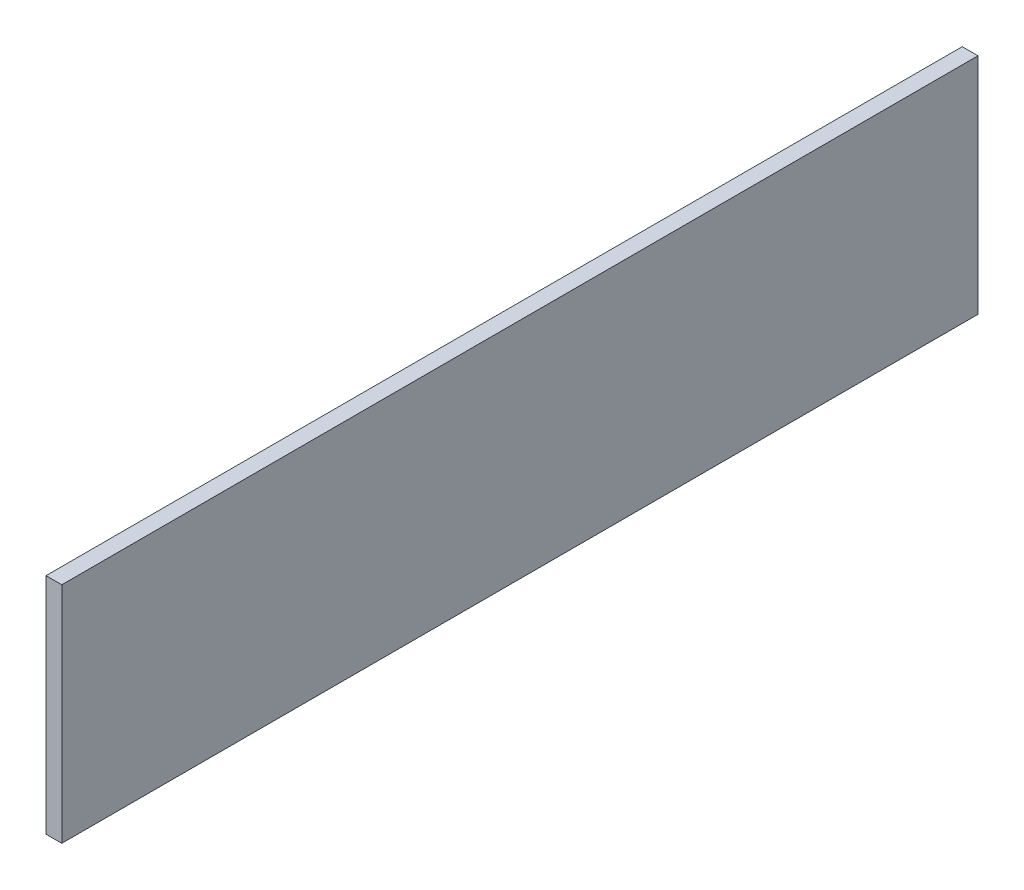
ISO-10303-21;
HEADER;
FILE_DESCRIPTION(('STEP AP214'),'2;1');
FILE_NAME('part.step','',(''),(''),'','','');
FILE_SCHEMA(('AUTOMOTIVE_DESIGN { 1 0 10303 214 1 1 1 1 }'));
ENDSEC;
DATA;
#1=APPLICATION_CONTEXT('core data for automotive mechanical design processes');
#2=APPLICATION_PROTOCOL_DEFINITION('international standard','automotive_design',2000,#1);
#3=PRODUCT_CONTEXT('',#1,'mechanical');
#4=PRODUCT('Part','Part','',(#3));
#5=PRODUCT_RELATED_PRODUCT_CATEGORY('part','',(#4));
#6=PRODUCT_DEFINITION_FORMATION('','',#4);
#7=PRODUCT_DEFINITION_CONTEXT('part definition',#1,'design');
#8=PRODUCT_DEFINITION('design','',#6,#7);
#9=PRODUCT_DEFINITION_SHAPE('','',#8);
#10=(LENGTH_UNIT() NAMED_UNIT(*) SI_UNIT(.MILLI.,.METRE.));
#11=(NAMED_UNIT(*) PLANE_ANGLE_UNIT() SI_UNIT($,.RADIAN.));
#12=(NAMED_UNIT(*) SI_UNIT($,.STERADIAN.) SOLID_ANGLE_UNIT());
#13=UNCERTAINTY_MEASURE_WITH_UNIT(LENGTH_MEASURE(1.E-05),#10,'distance_accuracy_value','');
#14=(GEOMETRIC_REPRESENTATION_CONTEXT(3) GLOBAL_UNCERTAINTY_ASSIGNED_CONTEXT((#13)) GLOBAL_UNIT_ASSIGNED_CONTEXT((#10,
#11,#12)) REPRESENTATION_CONTEXT('',''));
#15=CARTESIAN_POINT('',(0.,0.,0.));
#16=DIRECTION('',(0.,0.,1.));
#17=DIRECTION('',(1.,0.,0.));
#18=AXIS2_PLACEMENT_3D('',#15,#16,#17);
#19=CARTESIAN_POINT('',(5.,-26.218954248366,42.2287581699346));
#20=DIRECTION('',(0.,0.,-1.));
#21=DIRECTION('',(-1.,0.,0.));
#22=AXIS2_PLACEMENT_3D('',#19,#20,#21);
#23=PLANE('',#22);
#24=DIRECTION('',(0.,-1.,0.));
#25=VECTOR('',#24,1.);
#26=CARTESIAN_POINT('',(0.,-26.218954248366,42.2287581699346));
#27=LINE('',#26,#25);
#28=CARTESIAN_POINT('',(0.,44.781045751634,42.2287581699346));
#29=VERTEX_POINT('',#28);
#30=CARTESIAN_POINT('',(0.,-26.218954248366,42.2287581699346));
#31=VERTEX_POINT('',#30);
#32=EDGE_CURVE('E95',#29,#31,#27,.T.);
#33=ORIENTED_EDGE('',*,*,#32,.T.);
#34=DIRECTION('',(-1.,0.,0.));
#35=VECTOR('',#34,1.);
#36=CARTESIAN_POINT('',(5.,-26.218954248366,42.2287581699346));
#37=LINE('',#36,#35);
#38=CARTESIAN_POINT('',(5.,-26.218954248366,42.2287581699346));
#39=VERTEX_POINT('',#38);
#40=EDGE_CURVE('E11',#39,#31,#37,.T.);
#41=ORIENTED_EDGE('',*,*,#40,.F.);
#42=DIRECTION('',(0.,-1.,0.));
#43=VECTOR('',#42,1.);
#44=CARTESIAN_POINT('',(5.,-26.218954248366,42.2287581699346));
#45=LINE('',#44,#43);
#46=CARTESIAN_POINT('',(5.,44.781045751634,42.2287581699346));
#47=VERTEX_POINT('',#46);
#48=EDGE_CURVE('E83',#47,#39,#45,.T.);
#49=ORIENTED_EDGE('',*,*,#48,.F.);
#50=DIRECTION('',(-1.,0.,0.));
#51=VECTOR('',#50,1.);
#52=CARTESIAN_POINT('',(5.,44.781045751634,42.2287581699346));
#53=LINE('',#52,#51);
#54=EDGE_CURVE('E91',#47,#29,#53,.T.);
#55=ORIENTED_EDGE('',*,*,#54,.T.);
#56=EDGE_LOOP('',(#33,#41,#49,#55));
#57=FACE_BOUND('',#56,.T.);
#58=ADVANCED_FACE('F32',(#57),#23,.F.);
#59=CARTESIAN_POINT('',(5.,-26.218954248366,42.2287581699346));
#60=DIRECTION('',(0.,1.,0.));
#61=DIRECTION('',(0.,0.,1.));
#62=AXIS2_PLACEMENT_3D('',#59,#60,#61);
#63=PLANE('',#62);
#64=DIRECTION('',(0.,0.,-1.));
#65=VECTOR('',#64,1.);
#66=CARTESIAN_POINT('',(0.,-26.218954248366,42.2287581699346));
#67=LINE('',#66,#65);
#68=CARTESIAN_POINT('',(0.,-26.218954248366,-248.271241830065));
#69=VERTEX_POINT('',#68);
#70=EDGE_CURVE('E87',#31,#69,#67,.T.);
#71=ORIENTED_EDGE('',*,*,#70,.T.);
#72=DIRECTION('',(-1.,0.,0.));
#73=VECTOR('',#72,1.);
#74=CARTESIAN_POINT('',(5.,-26.218954248366,-248.271241830065));
#75=LINE('',#74,#73);
#76=CARTESIAN_POINT('',(5.,-26.218954248366,-248.271241830065));
#77=VERTEX_POINT('',#76);
#78=EDGE_CURVE('E40',#77,#69,#75,.T.);
#79=ORIENTED_EDGE('',*,*,#78,.F.);
#80=DIRECTION('',(0.,0.,-1.));
#81=VECTOR('',#80,1.);
#82=CARTESIAN_POINT('',(5.,-26.218954248366,42.2287581699346));
#83=LINE('',#82,#81);
#84=EDGE_CURVE('E78',#39,#77,#83,.T.);
#85=ORIENTED_EDGE('',*,*,#84,.F.);
#86=ORIENTED_EDGE('',*,*,#40,.T.);
#87=EDGE_LOOP('',(#71,#79,#85,#86));
#88=FACE_BOUND('',#87,.T.);
#89=ADVANCED_FACE('F86',(#88),#63,.F.);
#90=CARTESIAN_POINT('',(5.,-26.218954248366,-248.271241830065));
#91=DIRECTION('',(0.,0.,1.));
#92=DIRECTION('',(1.,0.,0.));
#93=AXIS2_PLACEMENT_3D('',#90,#91,#92);
#94=PLANE('',#93);
#95=DIRECTION('',(0.,1.,0.));
#96=VECTOR('',#95,1.);
#97=CARTESIAN_POINT('',(0.,-26.218954248366,-248.271241830065));
#98=LINE('',#97,#96);
#99=CARTESIAN_POINT('',(0.,44.781045751634,-248.271241830065));
#100=VERTEX_POINT('',#99);
#101=EDGE_CURVE('E65',#69,#100,#98,.T.);
#102=ORIENTED_EDGE('',*,*,#101,.T.);
#103=DIRECTION('',(-1.,0.,0.));
#104=VECTOR('',#103,1.);
#105=CARTESIAN_POINT('',(5.,44.781045751634,-248.271241830065));
#106=LINE('',#105,#104);
#107=CARTESIAN_POINT('',(5.,44.781045751634,-248.271241830065));
#108=VERTEX_POINT('',#107);
#109=EDGE_CURVE('E88',#108,#100,#106,.T.);
#110=ORIENTED_EDGE('',*,*,#109,.F.);
#111=DIRECTION('',(0.,1.,0.));
#112=VECTOR('',#111,1.);
#113=CARTESIAN_POINT('',(5.,-26.218954248366,-248.271241830065));
#114=LINE('',#113,#112);
#115=EDGE_CURVE('E81',#77,#108,#114,.T.);
#116=ORIENTED_EDGE('',*,*,#115,.F.);
#117=ORIENTED_EDGE('',*,*,#78,.T.);
#118=EDGE_LOOP('',(#102,#110,#116,#117));
#119=FACE_BOUND('',#118,.T.);
#120=ADVANCED_FACE('F89',(#119),#94,.F.);
#121=CARTESIAN_POINT('',(5.,44.781045751634,42.2287581699346));
#122=DIRECTION('',(0.,-1.,0.));
#123=DIRECTION('',(0.,0.,-1.));
#124=AXIS2_PLACEMENT_3D('',#121,#122,#123);
#125=PLANE('',#124);
#126=DIRECTION('',(0.,0.,1.));
#127=VECTOR('',#126,1.);
#128=CARTESIAN_POINT('',(0.,44.781045751634,42.2287581699346));
#129=LINE('',#128,#127);
#130=EDGE_CURVE('E71',#100,#29,#129,.T.);
#131=ORIENTED_EDGE('',*,*,#130,.T.);
#132=ORIENTED_EDGE('',*,*,#54,.F.);
#133=DIRECTION('',(0.,0.,1.));
#134=VECTOR('',#133,1.);
#135=CARTESIAN_POINT('',(5.,44.781045751634,42.2287581699346));
#136=LINE('',#135,#134);
#137=EDGE_CURVE('E48',#108,#47,#136,.T.);
#138=ORIENTED_EDGE('',*,*,#137,.F.);
#139=ORIENTED_EDGE('',*,*,#109,.T.);
#140=EDGE_LOOP('',(#131,#132,#138,#139));
#141=FACE_BOUND('',#140,.T.);
#142=ADVANCED_FACE('F102',(#141),#125,.F.);
#143=CARTESIAN_POINT('',(5.,0.,0.));
#144=DIRECTION('',(-1.,0.,0.));
#145=DIRECTION('',(0.,0.,1.));
#146=AXIS2_PLACEMENT_3D('',#143,#144,#145);
#147=PLANE('',#146);
#148=ORIENTED_EDGE('',*,*,#48,.T.);
#149=ORIENTED_EDGE('',*,*,#84,.T.);
#150=ORIENTED_EDGE('',*,*,#115,.T.);
#151=ORIENTED_EDGE('',*,*,#137,.T.);
#152=EDGE_LOOP('',(#148,#149,#150,#151));
#153=FACE_BOUND('',#152,.T.);
#154=ADVANCED_FACE('F79',(#153),#147,.F.);
#155=CARTESIAN_POINT('',(0.,0.,0.));
#156=DIRECTION('',(-1.,0.,0.));
#157=DIRECTION('',(0.,0.,1.));
#158=AXIS2_PLACEMENT_3D('',#155,#156,#157);
#159=PLANE('',#158);
#160=ORIENTED_EDGE('',*,*,#32,.F.);
#161=ORIENTED_EDGE('',*,*,#130,.F.);
#162=ORIENTED_EDGE('',*,*,#101,.F.);
#163=ORIENTED_EDGE('',*,*,#70,.F.);
#164=EDGE_LOOP('',(#160,#161,#162,#163));
#165=FACE_BOUND('',#164,.T.);
#166=ADVANCED_FACE('F105',(#165),#159,.T.);
#167=CLOSED_SHELL('',(#58,#89,#120,#142,#154,#166));
#168=MANIFOLD_SOLID_BREP('B2',#167);
#169=ADVANCED_BREP_SHAPE_REPRESENTATION('',(#18,#168),#14);
#170=SHAPE_DEFINITION_REPRESENTATION(#9,#169);
ENDSEC;
END-ISO-10303-21;
